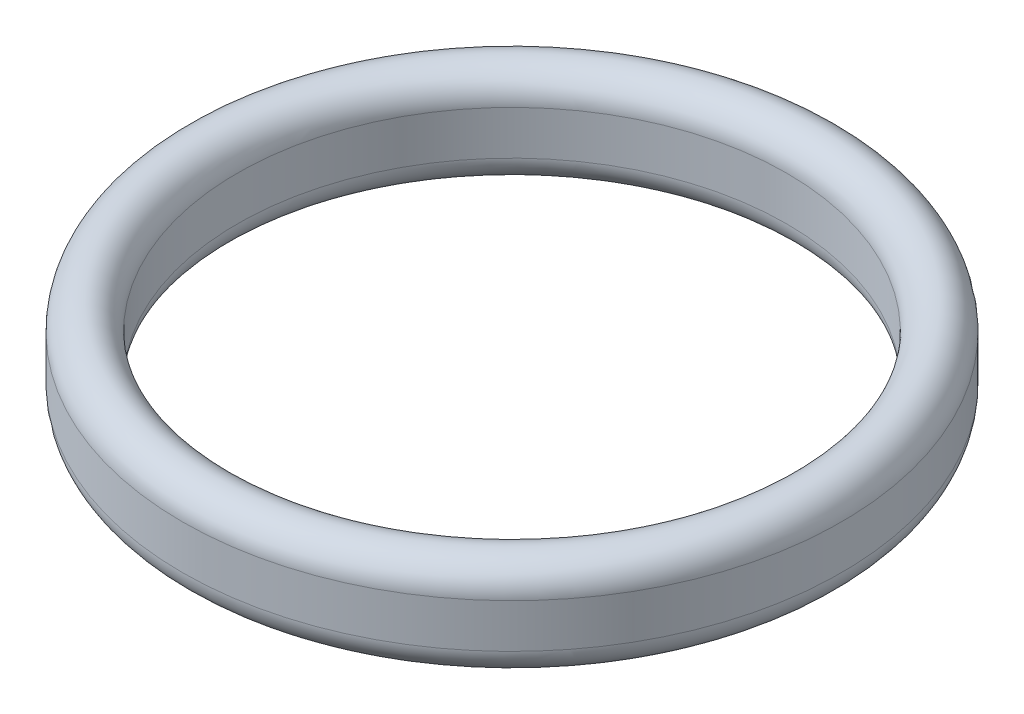
ISO-10303-21;
HEADER;
FILE_DESCRIPTION(('STEP AP214'),'2;1');
FILE_NAME('part.step','',(''),(''),'','','');
FILE_SCHEMA(('AUTOMOTIVE_DESIGN { 1 0 10303 214 1 1 1 1 }'));
ENDSEC;
DATA;
#1=APPLICATION_CONTEXT('core data for automotive mechanical design processes');
#2=APPLICATION_PROTOCOL_DEFINITION('international standard','automotive_design',2000,#1);
#3=PRODUCT_CONTEXT('',#1,'mechanical');
#4=PRODUCT('Part','Part','',(#3));
#5=PRODUCT_RELATED_PRODUCT_CATEGORY('part','',(#4));
#6=PRODUCT_DEFINITION_FORMATION('','',#4);
#7=PRODUCT_DEFINITION_CONTEXT('part definition',#1,'design');
#8=PRODUCT_DEFINITION('design','',#6,#7);
#9=PRODUCT_DEFINITION_SHAPE('','',#8);
#10=(LENGTH_UNIT() NAMED_UNIT(*) SI_UNIT(.MILLI.,.METRE.));
#11=(NAMED_UNIT(*) PLANE_ANGLE_UNIT() SI_UNIT($,.RADIAN.));
#12=(NAMED_UNIT(*) SI_UNIT($,.STERADIAN.) SOLID_ANGLE_UNIT());
#13=UNCERTAINTY_MEASURE_WITH_UNIT(LENGTH_MEASURE(1.E-05),#10,'distance_accuracy_value','');
#14=(GEOMETRIC_REPRESENTATION_CONTEXT(3) GLOBAL_UNCERTAINTY_ASSIGNED_CONTEXT((#13)) GLOBAL_UNIT_ASSIGNED_CONTEXT((#10,
#11,#12)) REPRESENTATION_CONTEXT('',''));
#15=CARTESIAN_POINT('',(0.,0.,0.));
#16=DIRECTION('',(0.,0.,1.));
#17=DIRECTION('',(1.,0.,0.));
#18=AXIS2_PLACEMENT_3D('',#15,#16,#17);
#19=CARTESIAN_POINT('',(0.,2.8,0.));
#20=DIRECTION('',(0.,-1.,0.));
#21=DIRECTION('',(0.,0.,-1.));
#22=AXIS2_PLACEMENT_3D('',#19,#20,#21);
#23=CYLINDRICAL_SURFACE('',#22,6.);
#24=CARTESIAN_POINT('',(0.,0.999998460411397,0.));
#25=DIRECTION('',(0.,-1.,0.));
#26=DIRECTION('',(0.,0.,-1.));
#27=AXIS2_PLACEMENT_3D('',#24,#25,#26);
#28=CIRCLE('',#27,6.);
#29=CARTESIAN_POINT('',(0.,0.999998460411397,-6.));
#30=VERTEX_POINT('',#29);
#31=EDGE_CURVE('E10',#30,#30,#28,.F.);
#32=ORIENTED_EDGE('',*,*,#31,.T.);
#33=EDGE_LOOP('',(#32));
#34=FACE_BOUND('',#33,.T.);
#35=CARTESIAN_POINT('',(0.,1.8000015395886,0.));
#36=DIRECTION('',(0.,-1.,0.));
#37=DIRECTION('',(0.,0.,-1.));
#38=AXIS2_PLACEMENT_3D('',#35,#36,#37);
#39=CIRCLE('',#38,6.);
#40=CARTESIAN_POINT('',(0.,1.8000015395886,-6.));
#41=VERTEX_POINT('',#40);
#42=EDGE_CURVE('E51',#41,#41,#39,.T.);
#43=ORIENTED_EDGE('',*,*,#42,.T.);
#44=EDGE_LOOP('',(#43));
#45=FACE_BOUND('',#44,.T.);
#46=ADVANCED_FACE('F43',(#34,#45),#23,.T.);
#47=CARTESIAN_POINT('',(0.,2.8,0.));
#48=DIRECTION('',(0.,-1.,0.));
#49=DIRECTION('',(0.,0.,-1.));
#50=AXIS2_PLACEMENT_3D('',#47,#48,#49);
#51=CYLINDRICAL_SURFACE('',#50,5.);
#52=CARTESIAN_POINT('',(0.,1.,0.));
#53=DIRECTION('',(0.,1.,0.));
#54=DIRECTION('',(0.,0.,1.));
#55=AXIS2_PLACEMENT_3D('',#52,#53,#54);
#56=CIRCLE('',#55,5.);
#57=CARTESIAN_POINT('',(0.,1.,5.));
#58=VERTEX_POINT('',#57);
#59=EDGE_CURVE('E56',#58,#58,#56,.F.);
#60=ORIENTED_EDGE('',*,*,#59,.T.);
#61=EDGE_LOOP('',(#60));
#62=FACE_BOUND('',#61,.T.);
#63=CARTESIAN_POINT('',(0.,1.8,0.));
#64=DIRECTION('',(0.,1.,0.));
#65=DIRECTION('',(0.,0.,1.));
#66=AXIS2_PLACEMENT_3D('',#63,#64,#65);
#67=CIRCLE('',#66,5.);
#68=CARTESIAN_POINT('',(0.,1.8,5.));
#69=VERTEX_POINT('',#68);
#70=EDGE_CURVE('E61',#69,#69,#67,.T.);
#71=ORIENTED_EDGE('',*,*,#70,.T.);
#72=EDGE_LOOP('',(#71));
#73=FACE_BOUND('',#72,.T.);
#74=ADVANCED_FACE('F68',(#62,#73),#51,.F.);
#75=CARTESIAN_POINT('',(0.,0.999998460411397,0.));
#76=DIRECTION('',(0.,-1.,0.));
#77=DIRECTION('',(0.,0.,-1.));
#78=AXIS2_PLACEMENT_3D('',#75,#76,#77);
#79=TOROIDAL_SURFACE('',#78,5.50000000000119,0.5);
#80=ORIENTED_EDGE('',*,*,#59,.F.);
#81=EDGE_LOOP('',(#80));
#82=FACE_BOUND('',#81,.T.);
#83=ORIENTED_EDGE('',*,*,#31,.F.);
#84=EDGE_LOOP('',(#83));
#85=FACE_BOUND('',#84,.T.);
#86=ADVANCED_FACE('F71',(#82,#85),#79,.T.);
#87=CARTESIAN_POINT('',(0.,1.8000015395886,0.));
#88=DIRECTION('',(0.,-1.,0.));
#89=DIRECTION('',(0.,0.,-1.));
#90=AXIS2_PLACEMENT_3D('',#87,#88,#89);
#91=TOROIDAL_SURFACE('',#90,5.50000000000119,0.5);
#92=ORIENTED_EDGE('',*,*,#42,.F.);
#93=EDGE_LOOP('',(#92));
#94=FACE_BOUND('',#93,.T.);
#95=ORIENTED_EDGE('',*,*,#70,.F.);
#96=EDGE_LOOP('',(#95));
#97=FACE_BOUND('',#96,.T.);
#98=ADVANCED_FACE('F45',(#94,#97),#91,.T.);
#99=CLOSED_SHELL('',(#46,#74,#86,#98));
#100=MANIFOLD_SOLID_BREP('B2',#99);
#101=ADVANCED_BREP_SHAPE_REPRESENTATION('',(#18,#100),#14);
#102=SHAPE_DEFINITION_REPRESENTATION(#9,#101);
ENDSEC;
END-ISO-10303-21;
